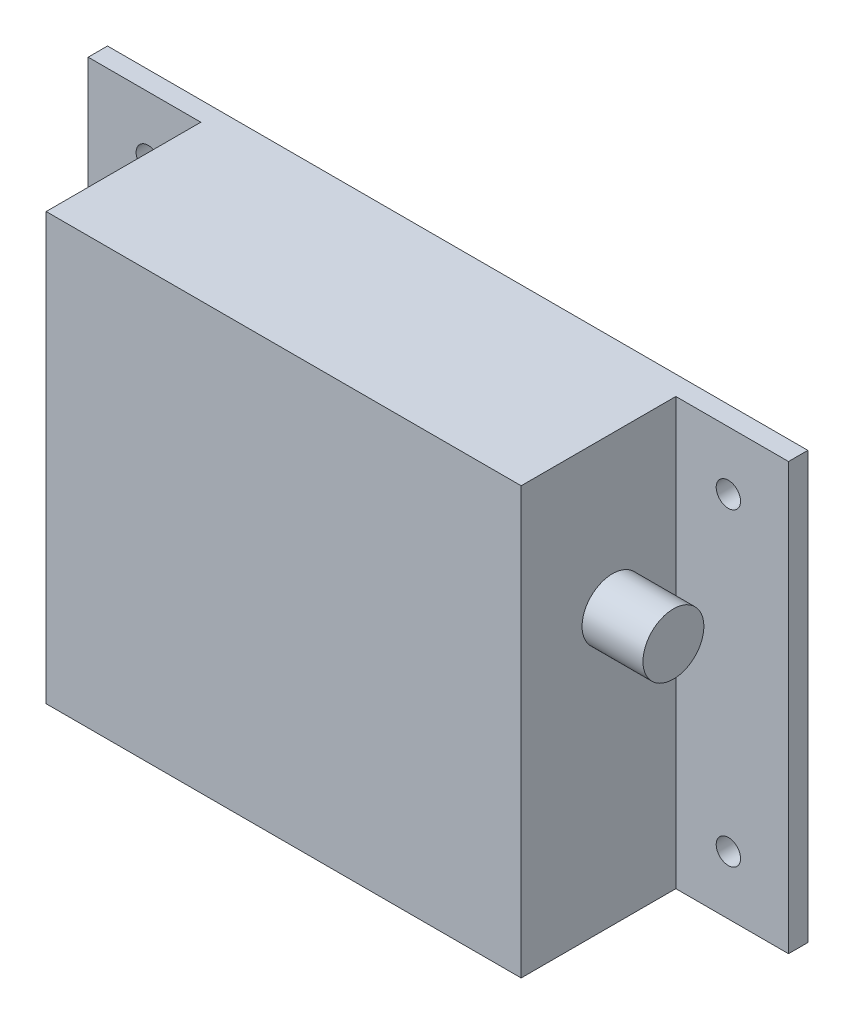
ISO-10303-21;
HEADER;
FILE_DESCRIPTION(('STEP AP214'),'2;1');
FILE_NAME('part.step','',(''),(''),'','','');
FILE_SCHEMA(('AUTOMOTIVE_DESIGN { 1 0 10303 214 1 1 1 1 }'));
ENDSEC;
DATA;
#1=APPLICATION_CONTEXT('core data for automotive mechanical design processes');
#2=APPLICATION_PROTOCOL_DEFINITION('international standard','automotive_design',2000,#1);
#3=PRODUCT_CONTEXT('',#1,'mechanical');
#4=PRODUCT('Part','Part','',(#3));
#5=PRODUCT_RELATED_PRODUCT_CATEGORY('part','',(#4));
#6=PRODUCT_DEFINITION_FORMATION('','',#4);
#7=PRODUCT_DEFINITION_CONTEXT('part definition',#1,'design');
#8=PRODUCT_DEFINITION('design','',#6,#7);
#9=PRODUCT_DEFINITION_SHAPE('','',#8);
#10=(LENGTH_UNIT() NAMED_UNIT(*) SI_UNIT(.MILLI.,.METRE.));
#11=(NAMED_UNIT(*) PLANE_ANGLE_UNIT() SI_UNIT($,.RADIAN.));
#12=(NAMED_UNIT(*) SI_UNIT($,.STERADIAN.) SOLID_ANGLE_UNIT());
#13=UNCERTAINTY_MEASURE_WITH_UNIT(LENGTH_MEASURE(1.E-05),#10,'distance_accuracy_value','');
#14=(GEOMETRIC_REPRESENTATION_CONTEXT(3) GLOBAL_UNCERTAINTY_ASSIGNED_CONTEXT((#13)) GLOBAL_UNIT_ASSIGNED_CONTEXT((#10,
#11,#12)) REPRESENTATION_CONTEXT('',''));
#15=CARTESIAN_POINT('',(0.,0.,0.));
#16=DIRECTION('',(0.,0.,1.));
#17=DIRECTION('',(1.,0.,0.));
#18=AXIS2_PLACEMENT_3D('',#15,#16,#17);
#19=CARTESIAN_POINT('',(39.,35.,28.575));
#20=DIRECTION('',(-1.,0.,0.));
#21=DIRECTION('',(0.,-1.,0.));
#22=AXIS2_PLACEMENT_3D('',#19,#20,#21);
#23=PLANE('',#22);
#24=CARTESIAN_POINT('',(39.,10.,13.575));
#25=DIRECTION('',(-1.,0.,0.));
#26=DIRECTION('',(0.,-1.,0.));
#27=AXIS2_PLACEMENT_3D('',#24,#25,#26);
#28=CIRCLE('',#27,5.);
#29=CARTESIAN_POINT('',(39.,5.,13.575));
#30=VERTEX_POINT('',#29);
#31=EDGE_CURVE('E239',#30,#30,#28,.T.);
#32=ORIENTED_EDGE('',*,*,#31,.T.);
#33=EDGE_LOOP('',(#32));
#34=FACE_BOUND('',#33,.T.);
#35=DIRECTION('',(0.,-1.,0.));
#36=VECTOR('',#35,1.);
#37=CARTESIAN_POINT('',(39.,35.,3.175));
#38=LINE('',#37,#36);
#39=CARTESIAN_POINT('',(39.,35.,3.175));
#40=VERTEX_POINT('',#39);
#41=CARTESIAN_POINT('',(39.,-35.,3.175));
#42=VERTEX_POINT('',#41);
#43=EDGE_CURVE('E56',#40,#42,#38,.T.);
#44=ORIENTED_EDGE('',*,*,#43,.F.);
#45=DIRECTION('',(0.,0.,-1.));
#46=VECTOR('',#45,1.);
#47=CARTESIAN_POINT('',(39.,35.,28.575));
#48=LINE('',#47,#46);
#49=CARTESIAN_POINT('',(39.,35.,28.575));
#50=VERTEX_POINT('',#49);
#51=EDGE_CURVE('E11',#50,#40,#48,.T.);
#52=ORIENTED_EDGE('',*,*,#51,.F.);
#53=DIRECTION('',(0.,1.,0.));
#54=VECTOR('',#53,1.);
#55=CARTESIAN_POINT('',(39.,35.,28.575));
#56=LINE('',#55,#54);
#57=CARTESIAN_POINT('',(39.,-35.,28.575));
#58=VERTEX_POINT('',#57);
#59=EDGE_CURVE('E167',#58,#50,#56,.T.);
#60=ORIENTED_EDGE('',*,*,#59,.F.);
#61=DIRECTION('',(0.,0.,-1.));
#62=VECTOR('',#61,1.);
#63=CARTESIAN_POINT('',(39.,-35.,28.575));
#64=LINE('',#63,#62);
#65=EDGE_CURVE('E181',#58,#42,#64,.T.);
#66=ORIENTED_EDGE('',*,*,#65,.T.);
#67=EDGE_LOOP('',(#44,#52,#60,#66));
#68=FACE_BOUND('',#67,.T.);
#69=ADVANCED_FACE('F39',(#34,#68),#23,.F.);
#70=CARTESIAN_POINT('',(-39.,35.,28.575));
#71=DIRECTION('',(1.,0.,0.));
#72=DIRECTION('',(0.,1.,0.));
#73=AXIS2_PLACEMENT_3D('',#70,#71,#72);
#74=PLANE('',#73);
#75=DIRECTION('',(0.,1.,0.));
#76=VECTOR('',#75,1.);
#77=CARTESIAN_POINT('',(-39.,35.,3.175));
#78=LINE('',#77,#76);
#79=CARTESIAN_POINT('',(-39.,-35.,3.175));
#80=VERTEX_POINT('',#79);
#81=CARTESIAN_POINT('',(-39.,35.,3.175));
#82=VERTEX_POINT('',#81);
#83=EDGE_CURVE('E125',#80,#82,#78,.T.);
#84=ORIENTED_EDGE('',*,*,#83,.F.);
#85=DIRECTION('',(0.,0.,-1.));
#86=VECTOR('',#85,1.);
#87=CARTESIAN_POINT('',(-39.,-35.,28.575));
#88=LINE('',#87,#86);
#89=CARTESIAN_POINT('',(-39.,-35.,28.575));
#90=VERTEX_POINT('',#89);
#91=EDGE_CURVE('E188',#90,#80,#88,.T.);
#92=ORIENTED_EDGE('',*,*,#91,.F.);
#93=DIRECTION('',(0.,-1.,0.));
#94=VECTOR('',#93,1.);
#95=CARTESIAN_POINT('',(-39.,35.,28.575));
#96=LINE('',#95,#94);
#97=CARTESIAN_POINT('',(-39.,35.,28.575));
#98=VERTEX_POINT('',#97);
#99=EDGE_CURVE('E175',#98,#90,#96,.T.);
#100=ORIENTED_EDGE('',*,*,#99,.F.);
#101=DIRECTION('',(0.,0.,-1.));
#102=VECTOR('',#101,1.);
#103=CARTESIAN_POINT('',(-39.,35.,28.575));
#104=LINE('',#103,#102);
#105=EDGE_CURVE('E48',#98,#82,#104,.T.);
#106=ORIENTED_EDGE('',*,*,#105,.T.);
#107=EDGE_LOOP('',(#84,#92,#100,#106));
#108=FACE_BOUND('',#107,.T.);
#109=ADVANCED_FACE('F230',(#108),#74,.F.);
#110=CARTESIAN_POINT('',(-39.,35.,28.575));
#111=DIRECTION('',(0.,-1.,0.));
#112=DIRECTION('',(0.,0.,-1.));
#113=AXIS2_PLACEMENT_3D('',#110,#111,#112);
#114=PLANE('',#113);
#115=DIRECTION('',(-1.,0.,0.));
#116=VECTOR('',#115,1.);
#117=CARTESIAN_POINT('',(-39.,35.,0.));
#118=LINE('',#117,#116);
#119=CARTESIAN_POINT('',(57.5,35.,0.));
#120=VERTEX_POINT('',#119);
#121=CARTESIAN_POINT('',(-57.5,35.,0.));
#122=VERTEX_POINT('',#121);
#123=EDGE_CURVE('E111',#120,#122,#118,.T.);
#124=ORIENTED_EDGE('',*,*,#123,.T.);
#125=DIRECTION('',(0.,0.,-1.));
#126=VECTOR('',#125,1.);
#127=CARTESIAN_POINT('',(-57.5,35.,3.175));
#128=LINE('',#127,#126);
#129=CARTESIAN_POINT('',(-57.5,35.,3.175));
#130=VERTEX_POINT('',#129);
#131=EDGE_CURVE('E106',#130,#122,#128,.T.);
#132=ORIENTED_EDGE('',*,*,#131,.F.);
#133=DIRECTION('',(1.,0.,0.));
#134=VECTOR('',#133,1.);
#135=CARTESIAN_POINT('',(57.5,35.,3.175));
#136=LINE('',#135,#134);
#137=EDGE_CURVE('E109',#130,#82,#136,.T.);
#138=ORIENTED_EDGE('',*,*,#137,.T.);
#139=ORIENTED_EDGE('',*,*,#105,.F.);
#140=DIRECTION('',(-1.,0.,0.));
#141=VECTOR('',#140,1.);
#142=CARTESIAN_POINT('',(-39.,35.,28.575));
#143=LINE('',#142,#141);
#144=EDGE_CURVE('E171',#50,#98,#143,.T.);
#145=ORIENTED_EDGE('',*,*,#144,.F.);
#146=ORIENTED_EDGE('',*,*,#51,.T.);
#147=CARTESIAN_POINT('',(57.5,35.,3.175));
#148=VERTEX_POINT('',#147);
#149=EDGE_CURVE('E128',#40,#148,#136,.T.);
#150=ORIENTED_EDGE('',*,*,#149,.T.);
#151=DIRECTION('',(0.,0.,-1.));
#152=VECTOR('',#151,1.);
#153=CARTESIAN_POINT('',(57.5,35.,3.175));
#154=LINE('',#153,#152);
#155=EDGE_CURVE('E117',#148,#120,#154,.T.);
#156=ORIENTED_EDGE('',*,*,#155,.T.);
#157=EDGE_LOOP('',(#124,#132,#138,#139,#145,#146,#150,#156));
#158=FACE_BOUND('',#157,.T.);
#159=ADVANCED_FACE('F108',(#158),#114,.F.);
#160=CARTESIAN_POINT('',(-39.,-35.,28.575));
#161=DIRECTION('',(0.,1.,0.));
#162=DIRECTION('',(0.,0.,1.));
#163=AXIS2_PLACEMENT_3D('',#160,#161,#162);
#164=PLANE('',#163);
#165=DIRECTION('',(1.,0.,0.));
#166=VECTOR('',#165,1.);
#167=CARTESIAN_POINT('',(-39.,-35.,0.));
#168=LINE('',#167,#166);
#169=CARTESIAN_POINT('',(-57.5,-35.,0.));
#170=VERTEX_POINT('',#169);
#171=CARTESIAN_POINT('',(57.5,-35.,0.));
#172=VERTEX_POINT('',#171);
#173=EDGE_CURVE('E172',#170,#172,#168,.T.);
#174=ORIENTED_EDGE('',*,*,#173,.T.);
#175=DIRECTION('',(0.,0.,-1.));
#176=VECTOR('',#175,1.);
#177=CARTESIAN_POINT('',(57.5,-35.,3.175));
#178=LINE('',#177,#176);
#179=CARTESIAN_POINT('',(57.5,-35.,3.175));
#180=VERTEX_POINT('',#179);
#181=EDGE_CURVE('E157',#180,#172,#178,.T.);
#182=ORIENTED_EDGE('',*,*,#181,.F.);
#183=DIRECTION('',(-1.,0.,0.));
#184=VECTOR('',#183,1.);
#185=CARTESIAN_POINT('',(57.5,-35.,3.175));
#186=LINE('',#185,#184);
#187=EDGE_CURVE('E118',#180,#42,#186,.T.);
#188=ORIENTED_EDGE('',*,*,#187,.T.);
#189=ORIENTED_EDGE('',*,*,#65,.F.);
#190=DIRECTION('',(1.,0.,0.));
#191=VECTOR('',#190,1.);
#192=CARTESIAN_POINT('',(-39.,-35.,28.575));
#193=LINE('',#192,#191);
#194=EDGE_CURVE('E178',#90,#58,#193,.T.);
#195=ORIENTED_EDGE('',*,*,#194,.F.);
#196=ORIENTED_EDGE('',*,*,#91,.T.);
#197=CARTESIAN_POINT('',(-57.5,-35.,3.175));
#198=VERTEX_POINT('',#197);
#199=EDGE_CURVE('E149',#80,#198,#186,.T.);
#200=ORIENTED_EDGE('',*,*,#199,.T.);
#201=DIRECTION('',(0.,0.,-1.));
#202=VECTOR('',#201,1.);
#203=CARTESIAN_POINT('',(-57.5,-35.,3.175));
#204=LINE('',#203,#202);
#205=EDGE_CURVE('E133',#198,#170,#204,.T.);
#206=ORIENTED_EDGE('',*,*,#205,.T.);
#207=EDGE_LOOP('',(#174,#182,#188,#189,#195,#196,#200,#206));
#208=FACE_BOUND('',#207,.T.);
#209=ADVANCED_FACE('F281',(#208),#164,.F.);
#210=CARTESIAN_POINT('',(0.,0.,28.575));
#211=DIRECTION('',(0.,0.,1.));
#212=DIRECTION('',(1.,0.,0.));
#213=AXIS2_PLACEMENT_3D('',#210,#211,#212);
#214=PLANE('',#213);
#215=ORIENTED_EDGE('',*,*,#59,.T.);
#216=ORIENTED_EDGE('',*,*,#144,.T.);
#217=ORIENTED_EDGE('',*,*,#99,.T.);
#218=ORIENTED_EDGE('',*,*,#194,.T.);
#219=EDGE_LOOP('',(#215,#216,#217,#218));
#220=FACE_BOUND('',#219,.T.);
#221=ADVANCED_FACE('F264',(#220),#214,.T.);
#222=CARTESIAN_POINT('',(0.,0.,0.));
#223=DIRECTION('',(0.,0.,1.));
#224=DIRECTION('',(1.,0.,0.));
#225=AXIS2_PLACEMENT_3D('',#222,#223,#224);
#226=PLANE('',#225);
#227=CARTESIAN_POINT('',(47.625,-25.4,0.));
#228=DIRECTION('',(0.,0.,-1.));
#229=DIRECTION('',(-1.,0.,0.));
#230=AXIS2_PLACEMENT_3D('',#227,#228,#229);
#231=CIRCLE('',#230,2.);
#232=CARTESIAN_POINT('',(45.625,-25.4,0.));
#233=VERTEX_POINT('',#232);
#234=EDGE_CURVE('E246',#233,#233,#231,.T.);
#235=ORIENTED_EDGE('',*,*,#234,.F.);
#236=EDGE_LOOP('',(#235));
#237=FACE_BOUND('',#236,.T.);
#238=CARTESIAN_POINT('',(-47.625,-25.4,0.));
#239=DIRECTION('',(0.,0.,-1.));
#240=DIRECTION('',(-1.,0.,0.));
#241=AXIS2_PLACEMENT_3D('',#238,#239,#240);
#242=CIRCLE('',#241,2.);
#243=CARTESIAN_POINT('',(-49.625,-25.4,0.));
#244=VERTEX_POINT('',#243);
#245=EDGE_CURVE('E253',#244,#244,#242,.T.);
#246=ORIENTED_EDGE('',*,*,#245,.F.);
#247=EDGE_LOOP('',(#246));
#248=FACE_BOUND('',#247,.T.);
#249=CARTESIAN_POINT('',(-47.625,25.4,0.));
#250=DIRECTION('',(0.,0.,-1.));
#251=DIRECTION('',(-1.,0.,0.));
#252=AXIS2_PLACEMENT_3D('',#249,#250,#251);
#253=CIRCLE('',#252,2.);
#254=CARTESIAN_POINT('',(-49.625,25.4,0.));
#255=VERTEX_POINT('',#254);
#256=EDGE_CURVE('E249',#255,#255,#253,.T.);
#257=ORIENTED_EDGE('',*,*,#256,.F.);
#258=EDGE_LOOP('',(#257));
#259=FACE_BOUND('',#258,.T.);
#260=CARTESIAN_POINT('',(47.625,25.4,0.));
#261=DIRECTION('',(0.,0.,-1.));
#262=DIRECTION('',(-1.,0.,0.));
#263=AXIS2_PLACEMENT_3D('',#260,#261,#262);
#264=CIRCLE('',#263,2.);
#265=CARTESIAN_POINT('',(45.625,25.4,0.));
#266=VERTEX_POINT('',#265);
#267=EDGE_CURVE('E143',#266,#266,#264,.T.);
#268=ORIENTED_EDGE('',*,*,#267,.F.);
#269=EDGE_LOOP('',(#268));
#270=FACE_BOUND('',#269,.T.);
#271=ORIENTED_EDGE('',*,*,#123,.F.);
#272=DIRECTION('',(0.,-1.,0.));
#273=VECTOR('',#272,1.);
#274=CARTESIAN_POINT('',(57.5,35.,0.));
#275=LINE('',#274,#273);
#276=EDGE_CURVE('E135',#120,#172,#275,.T.);
#277=ORIENTED_EDGE('',*,*,#276,.T.);
#278=ORIENTED_EDGE('',*,*,#173,.F.);
#279=DIRECTION('',(0.,1.,0.));
#280=VECTOR('',#279,1.);
#281=CARTESIAN_POINT('',(-57.5,35.,0.));
#282=LINE('',#281,#280);
#283=EDGE_CURVE('E140',#170,#122,#282,.T.);
#284=ORIENTED_EDGE('',*,*,#283,.T.);
#285=EDGE_LOOP('',(#271,#277,#278,#284));
#286=FACE_BOUND('',#285,.T.);
#287=ADVANCED_FACE('F261',(#237,#248,#259,#270,#286),#226,.F.);
#288=CARTESIAN_POINT('',(-57.5,35.,3.175));
#289=DIRECTION('',(-1.,0.,0.));
#290=DIRECTION('',(0.,0.,1.));
#291=AXIS2_PLACEMENT_3D('',#288,#289,#290);
#292=PLANE('',#291);
#293=ORIENTED_EDGE('',*,*,#283,.F.);
#294=ORIENTED_EDGE('',*,*,#205,.F.);
#295=DIRECTION('',(0.,1.,0.));
#296=VECTOR('',#295,1.);
#297=CARTESIAN_POINT('',(-57.5,35.,3.175));
#298=LINE('',#297,#296);
#299=EDGE_CURVE('E124',#198,#130,#298,.T.);
#300=ORIENTED_EDGE('',*,*,#299,.T.);
#301=ORIENTED_EDGE('',*,*,#131,.T.);
#302=EDGE_LOOP('',(#293,#294,#300,#301));
#303=FACE_BOUND('',#302,.T.);
#304=ADVANCED_FACE('F131',(#303),#292,.T.);
#305=CARTESIAN_POINT('',(0.,0.,3.175));
#306=DIRECTION('',(0.,0.,-1.));
#307=DIRECTION('',(-1.,0.,0.));
#308=AXIS2_PLACEMENT_3D('',#305,#306,#307);
#309=PLANE('',#308);
#310=CARTESIAN_POINT('',(-47.625,-25.4,3.175));
#311=DIRECTION('',(0.,0.,-1.));
#312=DIRECTION('',(-1.,0.,0.));
#313=AXIS2_PLACEMENT_3D('',#310,#311,#312);
#314=CIRCLE('',#313,2.);
#315=CARTESIAN_POINT('',(-49.625,-25.4,3.175));
#316=VERTEX_POINT('',#315);
#317=EDGE_CURVE('E42',#316,#316,#314,.T.);
#318=ORIENTED_EDGE('',*,*,#317,.T.);
#319=EDGE_LOOP('',(#318));
#320=FACE_BOUND('',#319,.T.);
#321=CARTESIAN_POINT('',(-47.625,25.4,3.175));
#322=DIRECTION('',(0.,0.,-1.));
#323=DIRECTION('',(-1.,0.,0.));
#324=AXIS2_PLACEMENT_3D('',#321,#322,#323);
#325=CIRCLE('',#324,2.);
#326=CARTESIAN_POINT('',(-49.625,25.4,3.175));
#327=VERTEX_POINT('',#326);
#328=EDGE_CURVE('E201',#327,#327,#325,.T.);
#329=ORIENTED_EDGE('',*,*,#328,.T.);
#330=EDGE_LOOP('',(#329));
#331=FACE_BOUND('',#330,.T.);
#332=ORIENTED_EDGE('',*,*,#199,.F.);
#333=ORIENTED_EDGE('',*,*,#83,.T.);
#334=ORIENTED_EDGE('',*,*,#137,.F.);
#335=ORIENTED_EDGE('',*,*,#299,.F.);
#336=EDGE_LOOP('',(#332,#333,#334,#335));
#337=FACE_BOUND('',#336,.T.);
#338=ADVANCED_FACE('F123',(#320,#331,#337),#309,.F.);
#339=CARTESIAN_POINT('',(47.625,-25.4,3.175));
#340=DIRECTION('',(0.,0.,-1.));
#341=DIRECTION('',(-1.,0.,0.));
#342=AXIS2_PLACEMENT_3D('',#339,#340,#341);
#343=CIRCLE('',#342,2.);
#344=CARTESIAN_POINT('',(45.625,-25.4,3.175));
#345=VERTEX_POINT('',#344);
#346=EDGE_CURVE('E198',#345,#345,#343,.T.);
#347=ORIENTED_EDGE('',*,*,#346,.T.);
#348=EDGE_LOOP('',(#347));
#349=FACE_BOUND('',#348,.T.);
#350=CARTESIAN_POINT('',(47.625,25.4,3.175));
#351=DIRECTION('',(0.,0.,-1.));
#352=DIRECTION('',(-1.,0.,0.));
#353=AXIS2_PLACEMENT_3D('',#350,#351,#352);
#354=CIRCLE('',#353,2.);
#355=CARTESIAN_POINT('',(45.625,25.4,3.175));
#356=VERTEX_POINT('',#355);
#357=EDGE_CURVE('E194',#356,#356,#354,.T.);
#358=ORIENTED_EDGE('',*,*,#357,.T.);
#359=EDGE_LOOP('',(#358));
#360=FACE_BOUND('',#359,.T.);
#361=ORIENTED_EDGE('',*,*,#149,.F.);
#362=ORIENTED_EDGE('',*,*,#43,.T.);
#363=ORIENTED_EDGE('',*,*,#187,.F.);
#364=DIRECTION('',(0.,-1.,0.));
#365=VECTOR('',#364,1.);
#366=CARTESIAN_POINT('',(57.5,35.,3.175));
#367=LINE('',#366,#365);
#368=EDGE_CURVE('E127',#148,#180,#367,.T.);
#369=ORIENTED_EDGE('',*,*,#368,.F.);
#370=EDGE_LOOP('',(#361,#362,#363,#369));
#371=FACE_BOUND('',#370,.T.);
#372=ADVANCED_FACE('F289',(#349,#360,#371),#309,.F.);
#373=CARTESIAN_POINT('',(57.5,35.,3.175));
#374=DIRECTION('',(1.,0.,0.));
#375=DIRECTION('',(0.,0.,-1.));
#376=AXIS2_PLACEMENT_3D('',#373,#374,#375);
#377=PLANE('',#376);
#378=ORIENTED_EDGE('',*,*,#276,.F.);
#379=ORIENTED_EDGE('',*,*,#155,.F.);
#380=ORIENTED_EDGE('',*,*,#368,.T.);
#381=ORIENTED_EDGE('',*,*,#181,.T.);
#382=EDGE_LOOP('',(#378,#379,#380,#381));
#383=FACE_BOUND('',#382,.T.);
#384=ADVANCED_FACE('F278',(#383),#377,.T.);
#385=CARTESIAN_POINT('',(47.625,25.4,28.575));
#386=DIRECTION('',(0.,0.,-1.));
#387=DIRECTION('',(-1.,0.,0.));
#388=AXIS2_PLACEMENT_3D('',#385,#386,#387);
#389=CYLINDRICAL_SURFACE('',#388,2.);
#390=ORIENTED_EDGE('',*,*,#267,.T.);
#391=EDGE_LOOP('',(#390));
#392=FACE_BOUND('',#391,.T.);
#393=ORIENTED_EDGE('',*,*,#357,.F.);
#394=EDGE_LOOP('',(#393));
#395=FACE_BOUND('',#394,.T.);
#396=ADVANCED_FACE('F298',(#392,#395),#389,.F.);
#397=CARTESIAN_POINT('',(47.625,-25.4,28.575));
#398=DIRECTION('',(0.,0.,-1.));
#399=DIRECTION('',(-1.,0.,0.));
#400=AXIS2_PLACEMENT_3D('',#397,#398,#399);
#401=CYLINDRICAL_SURFACE('',#400,2.);
#402=ORIENTED_EDGE('',*,*,#234,.T.);
#403=EDGE_LOOP('',(#402));
#404=FACE_BOUND('',#403,.T.);
#405=ORIENTED_EDGE('',*,*,#346,.F.);
#406=EDGE_LOOP('',(#405));
#407=FACE_BOUND('',#406,.T.);
#408=ADVANCED_FACE('F224',(#404,#407),#401,.F.);
#409=CARTESIAN_POINT('',(-47.625,25.4,28.575));
#410=DIRECTION('',(0.,0.,-1.));
#411=DIRECTION('',(-1.,0.,0.));
#412=AXIS2_PLACEMENT_3D('',#409,#410,#411);
#413=CYLINDRICAL_SURFACE('',#412,2.);
#414=ORIENTED_EDGE('',*,*,#256,.T.);
#415=EDGE_LOOP('',(#414));
#416=FACE_BOUND('',#415,.T.);
#417=ORIENTED_EDGE('',*,*,#328,.F.);
#418=EDGE_LOOP('',(#417));
#419=FACE_BOUND('',#418,.T.);
#420=ADVANCED_FACE('F214',(#416,#419),#413,.F.);
#421=CARTESIAN_POINT('',(-47.625,-25.4,28.575));
#422=DIRECTION('',(0.,0.,-1.));
#423=DIRECTION('',(-1.,0.,0.));
#424=AXIS2_PLACEMENT_3D('',#421,#422,#423);
#425=CYLINDRICAL_SURFACE('',#424,2.);
#426=ORIENTED_EDGE('',*,*,#245,.T.);
#427=EDGE_LOOP('',(#426));
#428=FACE_BOUND('',#427,.T.);
#429=ORIENTED_EDGE('',*,*,#317,.F.);
#430=EDGE_LOOP('',(#429));
#431=FACE_BOUND('',#430,.T.);
#432=ADVANCED_FACE('F211',(#428,#431),#425,.F.);
#433=CARTESIAN_POINT('',(49.,10.,13.575));
#434=DIRECTION('',(-1.,0.,0.));
#435=DIRECTION('',(0.,-1.,0.));
#436=AXIS2_PLACEMENT_3D('',#433,#434,#435);
#437=CYLINDRICAL_SURFACE('',#436,5.);
#438=CARTESIAN_POINT('',(49.,10.,13.575));
#439=DIRECTION('',(-1.,0.,0.));
#440=DIRECTION('',(0.,-1.,0.));
#441=AXIS2_PLACEMENT_3D('',#438,#439,#440);
#442=CIRCLE('',#441,5.);
#443=CARTESIAN_POINT('',(49.,5.,13.575));
#444=VERTEX_POINT('',#443);
#445=EDGE_CURVE('E242',#444,#444,#442,.T.);
#446=ORIENTED_EDGE('',*,*,#445,.T.);
#447=EDGE_LOOP('',(#446));
#448=FACE_BOUND('',#447,.T.);
#449=ORIENTED_EDGE('',*,*,#31,.F.);
#450=EDGE_LOOP('',(#449));
#451=FACE_BOUND('',#450,.T.);
#452=ADVANCED_FACE('F213',(#448,#451),#437,.T.);
#453=CARTESIAN_POINT('',(49.,10.,13.575));
#454=DIRECTION('',(-1.,0.,0.));
#455=DIRECTION('',(0.,-1.,0.));
#456=AXIS2_PLACEMENT_3D('',#453,#454,#455);
#457=PLANE('',#456);
#458=ORIENTED_EDGE('',*,*,#445,.F.);
#459=EDGE_LOOP('',(#458));
#460=FACE_BOUND('',#459,.T.);
#461=ADVANCED_FACE('F221',(#460),#457,.F.);
#462=CLOSED_SHELL('',(#69,#109,#159,#209,#221,#287,#304,#338,#372,#384,#396,#408,#420,#432,#452,#461));
#463=MANIFOLD_SOLID_BREP('B2',#462);
#464=ADVANCED_BREP_SHAPE_REPRESENTATION('',(#18,#463),#14);
#465=SHAPE_DEFINITION_REPRESENTATION(#9,#464);
ENDSEC;
END-ISO-10303-21;
